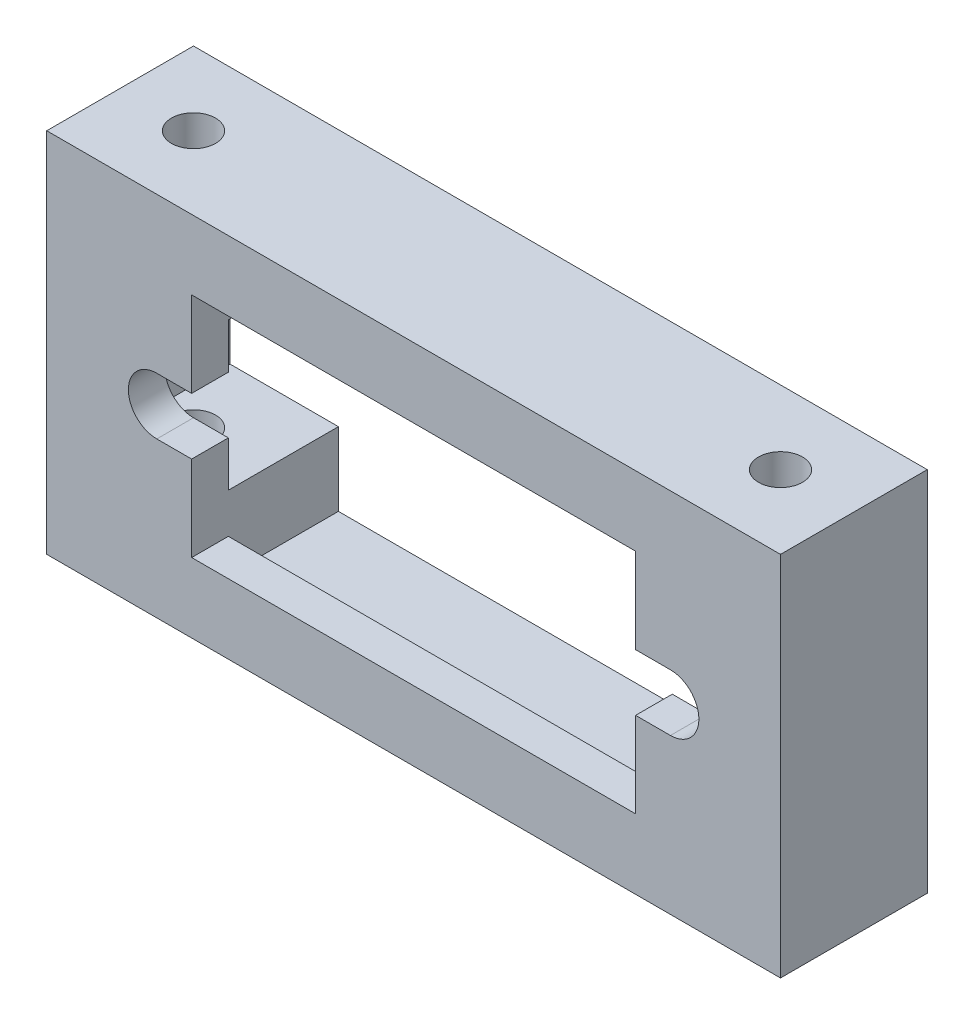
ISO-10303-21;
HEADER;
FILE_DESCRIPTION(('STEP AP214'),'2;1');
FILE_NAME('part.step','',(''),(''),'','','');
FILE_SCHEMA(('AUTOMOTIVE_DESIGN { 1 0 10303 214 1 1 1 1 }'));
ENDSEC;
DATA;
#1=APPLICATION_CONTEXT('core data for automotive mechanical design processes');
#2=APPLICATION_PROTOCOL_DEFINITION('international standard','automotive_design',2000,#1);
#3=PRODUCT_CONTEXT('',#1,'mechanical');
#4=PRODUCT('Part','Part','',(#3));
#5=PRODUCT_RELATED_PRODUCT_CATEGORY('part','',(#4));
#6=PRODUCT_DEFINITION_FORMATION('','',#4);
#7=PRODUCT_DEFINITION_CONTEXT('part definition',#1,'design');
#8=PRODUCT_DEFINITION('design','',#6,#7);
#9=PRODUCT_DEFINITION_SHAPE('','',#8);
#10=(LENGTH_UNIT() NAMED_UNIT(*) SI_UNIT(.MILLI.,.METRE.));
#11=(NAMED_UNIT(*) PLANE_ANGLE_UNIT() SI_UNIT($,.RADIAN.));
#12=(NAMED_UNIT(*) SI_UNIT($,.STERADIAN.) SOLID_ANGLE_UNIT());
#13=UNCERTAINTY_MEASURE_WITH_UNIT(LENGTH_MEASURE(1.E-05),#10,'distance_accuracy_value','');
#14=(GEOMETRIC_REPRESENTATION_CONTEXT(3) GLOBAL_UNCERTAINTY_ASSIGNED_CONTEXT((#13)) GLOBAL_UNIT_ASSIGNED_CONTEXT((#10,
#11,#12)) REPRESENTATION_CONTEXT('',''));
#15=CARTESIAN_POINT('',(0.,0.,0.));
#16=DIRECTION('',(0.,0.,1.));
#17=DIRECTION('',(1.,0.,0.));
#18=AXIS2_PLACEMENT_3D('',#15,#16,#17);
#19=CARTESIAN_POINT('',(0.,0.,0.));
#20=DIRECTION('',(0.,0.,1.));
#21=DIRECTION('',(1.,0.,0.));
#22=AXIS2_PLACEMENT_3D('',#19,#20,#21);
#23=PLANE('',#22);
#24=DIRECTION('',(1.,0.,0.));
#25=VECTOR('',#24,1.);
#26=CARTESIAN_POINT('',(18.,-4.02,0.));
#27=LINE('',#26,#25);
#28=CARTESIAN_POINT('',(12.1,-4.02,0.));
#29=VERTEX_POINT('',#28);
#30=CARTESIAN_POINT('',(18.,-4.02,0.));
#31=VERTEX_POINT('',#30);
#32=EDGE_CURVE('E553',#29,#31,#27,.T.);
#33=ORIENTED_EDGE('',*,*,#32,.F.);
#34=DIRECTION('',(0.,-1.,0.));
#35=VECTOR('',#34,1.);
#36=CARTESIAN_POINT('',(12.1,6.2,0.));
#37=LINE('',#36,#35);
#38=CARTESIAN_POINT('',(12.1,-1.55,0.));
#39=VERTEX_POINT('',#38);
#40=EDGE_CURVE('E413',#39,#29,#37,.T.);
#41=ORIENTED_EDGE('',*,*,#40,.F.);
#42=DIRECTION('',(1.,0.,0.));
#43=VECTOR('',#42,1.);
#44=CARTESIAN_POINT('',(0.,-1.55,0.));
#45=LINE('',#44,#43);
#46=CARTESIAN_POINT('',(14.,-1.55,0.));
#47=VERTEX_POINT('',#46);
#48=EDGE_CURVE('E334',#39,#47,#45,.T.);
#49=ORIENTED_EDGE('',*,*,#48,.T.);
#50=CARTESIAN_POINT('',(14.,0.,0.));
#51=DIRECTION('',(0.,0.,1.));
#52=DIRECTION('',(1.,0.,0.));
#53=AXIS2_PLACEMENT_3D('',#50,#51,#52);
#54=CIRCLE('',#53,1.55);
#55=CARTESIAN_POINT('',(14.,1.55,0.));
#56=VERTEX_POINT('',#55);
#57=EDGE_CURVE('E339',#56,#47,#54,.F.);
#58=ORIENTED_EDGE('',*,*,#57,.F.);
#59=DIRECTION('',(1.,0.,0.));
#60=VECTOR('',#59,1.);
#61=CARTESIAN_POINT('',(0.,1.55,0.));
#62=LINE('',#61,#60);
#63=CARTESIAN_POINT('',(12.1,1.55,0.));
#64=VERTEX_POINT('',#63);
#65=EDGE_CURVE('E331',#64,#56,#62,.T.);
#66=ORIENTED_EDGE('',*,*,#65,.F.);
#67=CARTESIAN_POINT('',(12.1,4.02,0.));
#68=VERTEX_POINT('',#67);
#69=EDGE_CURVE('E414',#68,#64,#37,.T.);
#70=ORIENTED_EDGE('',*,*,#69,.F.);
#71=DIRECTION('',(-1.,0.,0.));
#72=VECTOR('',#71,1.);
#73=CARTESIAN_POINT('',(18.,4.02000000000001,0.));
#74=LINE('',#73,#72);
#75=CARTESIAN_POINT('',(18.,4.02000000000001,0.));
#76=VERTEX_POINT('',#75);
#77=EDGE_CURVE('E516',#76,#68,#74,.T.);
#78=ORIENTED_EDGE('',*,*,#77,.F.);
#79=DIRECTION('',(0.,1.,0.));
#80=VECTOR('',#79,1.);
#81=CARTESIAN_POINT('',(18.,10.,0.));
#82=LINE('',#81,#80);
#83=EDGE_CURVE('E324',#31,#76,#82,.T.);
#84=ORIENTED_EDGE('',*,*,#83,.F.);
#85=EDGE_LOOP('',(#33,#41,#49,#58,#66,#70,#78,#84));
#86=FACE_BOUND('',#85,.T.);
#87=ADVANCED_FACE('F69',(#86),#23,.F.);
#88=DIRECTION('',(0.,1.,0.));
#89=VECTOR('',#88,1.);
#90=CARTESIAN_POINT('',(12.1,-8.02,0.));
#91=LINE('',#90,#89);
#92=CARTESIAN_POINT('',(12.1,-8.02,0.));
#93=VERTEX_POINT('',#92);
#94=CARTESIAN_POINT('',(12.1,-6.2,0.));
#95=VERTEX_POINT('',#94);
#96=EDGE_CURVE('E536',#93,#95,#91,.T.);
#97=ORIENTED_EDGE('',*,*,#96,.F.);
#98=DIRECTION('',(1.,0.,0.));
#99=VECTOR('',#98,1.);
#100=CARTESIAN_POINT('',(18.,-8.02,0.));
#101=LINE('',#100,#99);
#102=CARTESIAN_POINT('',(-12.1,-8.02,0.));
#103=VERTEX_POINT('',#102);
#104=EDGE_CURVE('E292',#103,#93,#101,.T.);
#105=ORIENTED_EDGE('',*,*,#104,.F.);
#106=DIRECTION('',(0.,-1.,0.));
#107=VECTOR('',#106,1.);
#108=CARTESIAN_POINT('',(-12.1,-8.02,0.));
#109=LINE('',#108,#107);
#110=CARTESIAN_POINT('',(-12.1,-6.2,0.));
#111=VERTEX_POINT('',#110);
#112=EDGE_CURVE('E527',#111,#103,#109,.T.);
#113=ORIENTED_EDGE('',*,*,#112,.F.);
#114=DIRECTION('',(1.,0.,0.));
#115=VECTOR('',#114,1.);
#116=CARTESIAN_POINT('',(-12.1,-6.2,0.));
#117=LINE('',#116,#115);
#118=EDGE_CURVE('E408',#111,#95,#117,.T.);
#119=ORIENTED_EDGE('',*,*,#118,.T.);
#120=EDGE_LOOP('',(#97,#105,#113,#119));
#121=FACE_BOUND('',#120,.T.);
#122=ADVANCED_FACE('F621',(#121),#23,.F.);
#123=DIRECTION('',(1.,0.,0.));
#124=VECTOR('',#123,1.);
#125=CARTESIAN_POINT('',(-18.,-4.02,0.));
#126=LINE('',#125,#124);
#127=CARTESIAN_POINT('',(-18.,-4.02,0.));
#128=VERTEX_POINT('',#127);
#129=CARTESIAN_POINT('',(-12.1,-4.02,0.));
#130=VERTEX_POINT('',#129);
#131=EDGE_CURVE('E270',#128,#130,#126,.T.);
#132=ORIENTED_EDGE('',*,*,#131,.F.);
#133=DIRECTION('',(0.,-1.,0.));
#134=VECTOR('',#133,1.);
#135=CARTESIAN_POINT('',(-18.,10.,0.));
#136=LINE('',#135,#134);
#137=CARTESIAN_POINT('',(-18.,4.02000000000001,0.));
#138=VERTEX_POINT('',#137);
#139=EDGE_CURVE('E309',#138,#128,#136,.T.);
#140=ORIENTED_EDGE('',*,*,#139,.F.);
#141=DIRECTION('',(-1.,0.,0.));
#142=VECTOR('',#141,1.);
#143=CARTESIAN_POINT('',(-18.,4.02000000000001,0.));
#144=LINE('',#143,#142);
#145=CARTESIAN_POINT('',(-12.1,4.02000000000001,0.));
#146=VERTEX_POINT('',#145);
#147=EDGE_CURVE('E511',#146,#138,#144,.T.);
#148=ORIENTED_EDGE('',*,*,#147,.F.);
#149=DIRECTION('',(0.,-1.,0.));
#150=VECTOR('',#149,1.);
#151=CARTESIAN_POINT('',(-12.1,6.2,0.));
#152=LINE('',#151,#150);
#153=CARTESIAN_POINT('',(-12.1,1.55,0.));
#154=VERTEX_POINT('',#153);
#155=EDGE_CURVE('E405',#146,#154,#152,.T.);
#156=ORIENTED_EDGE('',*,*,#155,.T.);
#157=DIRECTION('',(1.,0.,0.));
#158=VECTOR('',#157,1.);
#159=CARTESIAN_POINT('',(0.,1.55,0.));
#160=LINE('',#159,#158);
#161=CARTESIAN_POINT('',(-14.,1.55,0.));
#162=VERTEX_POINT('',#161);
#163=EDGE_CURVE('E369',#162,#154,#160,.T.);
#164=ORIENTED_EDGE('',*,*,#163,.F.);
#165=CARTESIAN_POINT('',(-14.,0.,0.));
#166=DIRECTION('',(0.,0.,1.));
#167=DIRECTION('',(1.,0.,0.));
#168=AXIS2_PLACEMENT_3D('',#165,#166,#167);
#169=CIRCLE('',#168,1.55);
#170=CARTESIAN_POINT('',(-14.,-1.55,0.));
#171=VERTEX_POINT('',#170);
#172=EDGE_CURVE('E373',#162,#171,#169,.T.);
#173=ORIENTED_EDGE('',*,*,#172,.T.);
#174=DIRECTION('',(1.,0.,0.));
#175=VECTOR('',#174,1.);
#176=CARTESIAN_POINT('',(0.,-1.55,0.));
#177=LINE('',#176,#175);
#178=CARTESIAN_POINT('',(-12.1,-1.55,0.));
#179=VERTEX_POINT('',#178);
#180=EDGE_CURVE('E378',#171,#179,#177,.T.);
#181=ORIENTED_EDGE('',*,*,#180,.T.);
#182=EDGE_CURVE('E409',#179,#130,#152,.T.);
#183=ORIENTED_EDGE('',*,*,#182,.T.);
#184=EDGE_LOOP('',(#132,#140,#148,#156,#164,#173,#181,#183));
#185=FACE_BOUND('',#184,.T.);
#186=ADVANCED_FACE('F634',(#185),#23,.F.);
#187=DIRECTION('',(0.,-1.,0.));
#188=VECTOR('',#187,1.);
#189=CARTESIAN_POINT('',(-12.1,8.02,0.));
#190=LINE('',#189,#188);
#191=CARTESIAN_POINT('',(-12.1,8.02,0.));
#192=VERTEX_POINT('',#191);
#193=CARTESIAN_POINT('',(-12.1,6.2,0.));
#194=VERTEX_POINT('',#193);
#195=EDGE_CURVE('E514',#192,#194,#190,.T.);
#196=ORIENTED_EDGE('',*,*,#195,.F.);
#197=DIRECTION('',(-1.,0.,0.));
#198=VECTOR('',#197,1.);
#199=CARTESIAN_POINT('',(18.,8.02,0.));
#200=LINE('',#199,#198);
#201=CARTESIAN_POINT('',(12.1,8.02,0.));
#202=VERTEX_POINT('',#201);
#203=EDGE_CURVE('E278',#202,#192,#200,.T.);
#204=ORIENTED_EDGE('',*,*,#203,.F.);
#205=DIRECTION('',(0.,1.,0.));
#206=VECTOR('',#205,1.);
#207=CARTESIAN_POINT('',(12.1,8.02,0.));
#208=LINE('',#207,#206);
#209=CARTESIAN_POINT('',(12.1,6.2,0.));
#210=VERTEX_POINT('',#209);
#211=EDGE_CURVE('E568',#210,#202,#208,.T.);
#212=ORIENTED_EDGE('',*,*,#211,.F.);
#213=DIRECTION('',(1.,0.,0.));
#214=VECTOR('',#213,1.);
#215=CARTESIAN_POINT('',(-12.1,6.2,0.));
#216=LINE('',#215,#214);
#217=EDGE_CURVE('E417',#194,#210,#216,.T.);
#218=ORIENTED_EDGE('',*,*,#217,.F.);
#219=EDGE_LOOP('',(#196,#204,#212,#218));
#220=FACE_BOUND('',#219,.T.);
#221=ADVANCED_FACE('F679',(#220),#23,.F.);
#222=CARTESIAN_POINT('',(18.,10.,-6.));
#223=DIRECTION('',(1.,0.,0.));
#224=DIRECTION('',(0.,1.,0.));
#225=AXIS2_PLACEMENT_3D('',#222,#223,#224);
#226=PLANE('',#225);
#227=DIRECTION('',(0.,0.,1.));
#228=VECTOR('',#227,1.);
#229=CARTESIAN_POINT('',(18.,-4.02,-13.1281133548787));
#230=LINE('',#229,#228);
#231=CARTESIAN_POINT('',(18.,-4.02,-6.));
#232=VERTEX_POINT('',#231);
#233=EDGE_CURVE('E549',#232,#31,#230,.T.);
#234=ORIENTED_EDGE('',*,*,#233,.T.);
#235=ORIENTED_EDGE('',*,*,#83,.T.);
#236=DIRECTION('',(0.,0.,1.));
#237=VECTOR('',#236,1.);
#238=CARTESIAN_POINT('',(18.,4.02000000000001,-13.1281133548787));
#239=LINE('',#238,#237);
#240=CARTESIAN_POINT('',(18.,4.02000000000001,-6.));
#241=VERTEX_POINT('',#240);
#242=EDGE_CURVE('E562',#241,#76,#239,.T.);
#243=ORIENTED_EDGE('',*,*,#242,.F.);
#244=DIRECTION('',(0.,1.,0.));
#245=VECTOR('',#244,1.);
#246=CARTESIAN_POINT('',(18.,10.,-6.));
#247=LINE('',#246,#245);
#248=EDGE_CURVE('E285',#232,#241,#247,.T.);
#249=ORIENTED_EDGE('',*,*,#248,.F.);
#250=EDGE_LOOP('',(#234,#235,#243,#249));
#251=FACE_BOUND('',#250,.T.);
#252=ADVANCED_FACE('F588',(#251),#226,.F.);
#253=CARTESIAN_POINT('',(-18.,10.,-6.));
#254=DIRECTION('',(-1.,0.,0.));
#255=DIRECTION('',(0.,-1.,0.));
#256=AXIS2_PLACEMENT_3D('',#253,#254,#255);
#257=PLANE('',#256);
#258=DIRECTION('',(0.,0.,1.));
#259=VECTOR('',#258,1.);
#260=CARTESIAN_POINT('',(-18.,-4.02,-13.1281133548787));
#261=LINE('',#260,#259);
#262=CARTESIAN_POINT('',(-18.,-4.02,-6.));
#263=VERTEX_POINT('',#262);
#264=EDGE_CURVE('E518',#263,#128,#261,.T.);
#265=ORIENTED_EDGE('',*,*,#264,.F.);
#266=DIRECTION('',(0.,-1.,0.));
#267=VECTOR('',#266,1.);
#268=CARTESIAN_POINT('',(-18.,10.,-6.));
#269=LINE('',#268,#267);
#270=CARTESIAN_POINT('',(-18.,4.02000000000001,-6.));
#271=VERTEX_POINT('',#270);
#272=EDGE_CURVE('E312',#271,#263,#269,.T.);
#273=ORIENTED_EDGE('',*,*,#272,.F.);
#274=DIRECTION('',(0.,0.,1.));
#275=VECTOR('',#274,1.);
#276=CARTESIAN_POINT('',(-18.,4.02000000000001,-13.1281133548787));
#277=LINE('',#276,#275);
#278=EDGE_CURVE('E507',#271,#138,#277,.T.);
#279=ORIENTED_EDGE('',*,*,#278,.T.);
#280=ORIENTED_EDGE('',*,*,#139,.T.);
#281=EDGE_LOOP('',(#265,#273,#279,#280));
#282=FACE_BOUND('',#281,.T.);
#283=ADVANCED_FACE('F692',(#282),#257,.F.);
#284=CARTESIAN_POINT('',(18.,-8.02,-42.0544088843515));
#285=DIRECTION('',(0.,-1.,0.));
#286=DIRECTION('',(1.,0.,0.));
#287=AXIS2_PLACEMENT_3D('',#284,#285,#286);
#288=PLANE('',#287);
#289=DIRECTION('',(0.,0.,1.));
#290=VECTOR('',#289,1.);
#291=CARTESIAN_POINT('',(12.1,-8.02,-13.1281133548787));
#292=LINE('',#291,#290);
#293=CARTESIAN_POINT('',(12.1,-8.02,-6.));
#294=VERTEX_POINT('',#293);
#295=EDGE_CURVE('E543',#294,#93,#292,.T.);
#296=ORIENTED_EDGE('',*,*,#295,.F.);
#297=DIRECTION('',(1.,0.,0.));
#298=VECTOR('',#297,1.);
#299=CARTESIAN_POINT('',(18.,-8.02,-6.));
#300=LINE('',#299,#298);
#301=CARTESIAN_POINT('',(-12.1,-8.02,-6.));
#302=VERTEX_POINT('',#301);
#303=EDGE_CURVE('E296',#302,#294,#300,.T.);
#304=ORIENTED_EDGE('',*,*,#303,.F.);
#305=DIRECTION('',(0.,0.,1.));
#306=VECTOR('',#305,1.);
#307=CARTESIAN_POINT('',(-12.1,-8.02,-13.1281133548787));
#308=LINE('',#307,#306);
#309=EDGE_CURVE('E87',#302,#103,#308,.T.);
#310=ORIENTED_EDGE('',*,*,#309,.T.);
#311=ORIENTED_EDGE('',*,*,#104,.T.);
#312=EDGE_LOOP('',(#296,#304,#310,#311));
#313=FACE_BOUND('',#312,.T.);
#314=ADVANCED_FACE('F626',(#313),#288,.F.);
#315=CARTESIAN_POINT('',(18.,8.02,-42.0544088843515));
#316=DIRECTION('',(0.,1.,0.));
#317=DIRECTION('',(0.,0.,1.));
#318=AXIS2_PLACEMENT_3D('',#315,#316,#317);
#319=PLANE('',#318);
#320=DIRECTION('',(0.,0.,1.));
#321=VECTOR('',#320,1.);
#322=CARTESIAN_POINT('',(-12.1,8.02,-13.1281133548787));
#323=LINE('',#322,#321);
#324=CARTESIAN_POINT('',(-12.1,8.02,-6.));
#325=VERTEX_POINT('',#324);
#326=EDGE_CURVE('E262',#325,#192,#323,.T.);
#327=ORIENTED_EDGE('',*,*,#326,.F.);
#328=DIRECTION('',(-1.,0.,0.));
#329=VECTOR('',#328,1.);
#330=CARTESIAN_POINT('',(18.,8.02,-6.));
#331=LINE('',#330,#329);
#332=CARTESIAN_POINT('',(12.1,8.02,-6.));
#333=VERTEX_POINT('',#332);
#334=EDGE_CURVE('E276',#333,#325,#331,.T.);
#335=ORIENTED_EDGE('',*,*,#334,.F.);
#336=DIRECTION('',(0.,0.,1.));
#337=VECTOR('',#336,1.);
#338=CARTESIAN_POINT('',(12.1,8.02,-13.1281133548787));
#339=LINE('',#338,#337);
#340=EDGE_CURVE('E95',#333,#202,#339,.T.);
#341=ORIENTED_EDGE('',*,*,#340,.T.);
#342=ORIENTED_EDGE('',*,*,#203,.T.);
#343=EDGE_LOOP('',(#327,#335,#341,#342));
#344=FACE_BOUND('',#343,.T.);
#345=ADVANCED_FACE('F275',(#344),#319,.F.);
#346=CARTESIAN_POINT('',(20.,10.,2.));
#347=DIRECTION('',(-1.,0.,0.));
#348=DIRECTION('',(0.,0.,1.));
#349=AXIS2_PLACEMENT_3D('',#346,#347,#348);
#350=PLANE('',#349);
#351=DIRECTION('',(0.,0.,-1.));
#352=VECTOR('',#351,1.);
#353=CARTESIAN_POINT('',(20.,-10.,2.));
#354=LINE('',#353,#352);
#355=CARTESIAN_POINT('',(20.,-10.,2.));
#356=VERTEX_POINT('',#355);
#357=CARTESIAN_POINT('',(20.,-10.,-6.));
#358=VERTEX_POINT('',#357);
#359=EDGE_CURVE('E462',#356,#358,#354,.T.);
#360=ORIENTED_EDGE('',*,*,#359,.T.);
#361=DIRECTION('',(0.,-1.,0.));
#362=VECTOR('',#361,1.);
#363=CARTESIAN_POINT('',(20.,10.,-6.));
#364=LINE('',#363,#362);
#365=CARTESIAN_POINT('',(20.,10.,-6.));
#366=VERTEX_POINT('',#365);
#367=EDGE_CURVE('E290',#366,#358,#364,.T.);
#368=ORIENTED_EDGE('',*,*,#367,.F.);
#369=DIRECTION('',(0.,0.,-1.));
#370=VECTOR('',#369,1.);
#371=CARTESIAN_POINT('',(20.,10.,2.));
#372=LINE('',#371,#370);
#373=CARTESIAN_POINT('',(20.,10.,2.));
#374=VERTEX_POINT('',#373);
#375=EDGE_CURVE('E12',#374,#366,#372,.T.);
#376=ORIENTED_EDGE('',*,*,#375,.F.);
#377=DIRECTION('',(0.,1.,0.));
#378=VECTOR('',#377,1.);
#379=CARTESIAN_POINT('',(20.,10.,2.));
#380=LINE('',#379,#378);
#381=EDGE_CURVE('E359',#356,#374,#380,.T.);
#382=ORIENTED_EDGE('',*,*,#381,.F.);
#383=EDGE_LOOP('',(#360,#368,#376,#382));
#384=FACE_BOUND('',#383,.T.);
#385=ADVANCED_FACE('F71',(#384),#350,.F.);
#386=CARTESIAN_POINT('',(-20.,10.,2.));
#387=DIRECTION('',(0.,-1.,0.));
#388=DIRECTION('',(0.,0.,-1.));
#389=AXIS2_PLACEMENT_3D('',#386,#387,#388);
#390=PLANE('',#389);
#391=CARTESIAN_POINT('',(-16.,10.,-2.));
#392=DIRECTION('',(0.,1.,0.));
#393=DIRECTION('',(0.,0.,1.));
#394=AXIS2_PLACEMENT_3D('',#391,#392,#393);
#395=CIRCLE('',#394,1.2);
#396=CARTESIAN_POINT('',(-16.,10.,-0.799999999999995));
#397=VERTEX_POINT('',#396);
#398=EDGE_CURVE('E482',#397,#397,#395,.T.);
#399=ORIENTED_EDGE('',*,*,#398,.F.);
#400=EDGE_LOOP('',(#399));
#401=FACE_BOUND('',#400,.T.);
#402=CARTESIAN_POINT('',(16.,10.,-2.));
#403=DIRECTION('',(0.,1.,0.));
#404=DIRECTION('',(0.,0.,1.));
#405=AXIS2_PLACEMENT_3D('',#402,#403,#404);
#406=CIRCLE('',#405,1.2);
#407=CARTESIAN_POINT('',(16.,10.,-0.799999999999995));
#408=VERTEX_POINT('',#407);
#409=EDGE_CURVE('E488',#408,#408,#406,.T.);
#410=ORIENTED_EDGE('',*,*,#409,.F.);
#411=EDGE_LOOP('',(#410));
#412=FACE_BOUND('',#411,.T.);
#413=ORIENTED_EDGE('',*,*,#375,.T.);
#414=DIRECTION('',(1.,0.,0.));
#415=VECTOR('',#414,1.);
#416=CARTESIAN_POINT('',(-20.,10.,-6.));
#417=LINE('',#416,#415);
#418=CARTESIAN_POINT('',(-20.,10.,-6.));
#419=VERTEX_POINT('',#418);
#420=EDGE_CURVE('E308',#419,#366,#417,.T.);
#421=ORIENTED_EDGE('',*,*,#420,.F.);
#422=DIRECTION('',(0.,0.,-1.));
#423=VECTOR('',#422,1.);
#424=CARTESIAN_POINT('',(-20.,10.,2.));
#425=LINE('',#424,#423);
#426=CARTESIAN_POINT('',(-20.,10.,2.));
#427=VERTEX_POINT('',#426);
#428=EDGE_CURVE('E79',#427,#419,#425,.T.);
#429=ORIENTED_EDGE('',*,*,#428,.F.);
#430=DIRECTION('',(-1.,0.,0.));
#431=VECTOR('',#430,1.);
#432=CARTESIAN_POINT('',(-20.,10.,2.));
#433=LINE('',#432,#431);
#434=EDGE_CURVE('E453',#374,#427,#433,.T.);
#435=ORIENTED_EDGE('',*,*,#434,.F.);
#436=EDGE_LOOP('',(#413,#421,#429,#435));
#437=FACE_BOUND('',#436,.T.);
#438=ADVANCED_FACE('F959',(#401,#412,#437),#390,.F.);
#439=CARTESIAN_POINT('',(-20.,10.,2.));
#440=DIRECTION('',(1.,0.,0.));
#441=DIRECTION('',(0.,0.,-1.));
#442=AXIS2_PLACEMENT_3D('',#439,#440,#441);
#443=PLANE('',#442);
#444=ORIENTED_EDGE('',*,*,#428,.T.);
#445=DIRECTION('',(0.,1.,0.));
#446=VECTOR('',#445,1.);
#447=CARTESIAN_POINT('',(-20.,10.,-6.));
#448=LINE('',#447,#446);
#449=CARTESIAN_POINT('',(-20.,-10.,-6.));
#450=VERTEX_POINT('',#449);
#451=EDGE_CURVE('E304',#450,#419,#448,.T.);
#452=ORIENTED_EDGE('',*,*,#451,.F.);
#453=DIRECTION('',(0.,0.,-1.));
#454=VECTOR('',#453,1.);
#455=CARTESIAN_POINT('',(-20.,-10.,2.));
#456=LINE('',#455,#454);
#457=CARTESIAN_POINT('',(-20.,-10.,2.));
#458=VERTEX_POINT('',#457);
#459=EDGE_CURVE('E466',#458,#450,#456,.T.);
#460=ORIENTED_EDGE('',*,*,#459,.F.);
#461=DIRECTION('',(0.,-1.,0.));
#462=VECTOR('',#461,1.);
#463=CARTESIAN_POINT('',(-20.,10.,2.));
#464=LINE('',#463,#462);
#465=EDGE_CURVE('E456',#427,#458,#464,.T.);
#466=ORIENTED_EDGE('',*,*,#465,.F.);
#467=EDGE_LOOP('',(#444,#452,#460,#466));
#468=FACE_BOUND('',#467,.T.);
#469=ADVANCED_FACE('F952',(#468),#443,.F.);
#470=CARTESIAN_POINT('',(-20.,-10.,2.));
#471=DIRECTION('',(0.,1.,0.));
#472=DIRECTION('',(0.,0.,1.));
#473=AXIS2_PLACEMENT_3D('',#470,#471,#472);
#474=PLANE('',#473);
#475=CARTESIAN_POINT('',(-16.,-10.,-2.));
#476=DIRECTION('',(0.,1.,0.));
#477=DIRECTION('',(0.,0.,1.));
#478=AXIS2_PLACEMENT_3D('',#475,#476,#477);
#479=CIRCLE('',#478,1.2);
#480=CARTESIAN_POINT('',(-16.,-10.,-0.799999999999995));
#481=VERTEX_POINT('',#480);
#482=EDGE_CURVE('E474',#481,#481,#479,.T.);
#483=ORIENTED_EDGE('',*,*,#482,.T.);
#484=EDGE_LOOP('',(#483));
#485=FACE_BOUND('',#484,.T.);
#486=CARTESIAN_POINT('',(16.,-10.,-2.));
#487=DIRECTION('',(0.,1.,0.));
#488=DIRECTION('',(0.,0.,1.));
#489=AXIS2_PLACEMENT_3D('',#486,#487,#488);
#490=CIRCLE('',#489,1.2);
#491=CARTESIAN_POINT('',(16.,-10.,-0.799999999999995));
#492=VERTEX_POINT('',#491);
#493=EDGE_CURVE('E494',#492,#492,#490,.T.);
#494=ORIENTED_EDGE('',*,*,#493,.T.);
#495=EDGE_LOOP('',(#494));
#496=FACE_BOUND('',#495,.T.);
#497=ORIENTED_EDGE('',*,*,#459,.T.);
#498=DIRECTION('',(-1.,0.,0.));
#499=VECTOR('',#498,1.);
#500=CARTESIAN_POINT('',(-20.,-10.,-6.));
#501=LINE('',#500,#499);
#502=EDGE_CURVE('E316',#358,#450,#501,.T.);
#503=ORIENTED_EDGE('',*,*,#502,.F.);
#504=ORIENTED_EDGE('',*,*,#359,.F.);
#505=DIRECTION('',(1.,0.,0.));
#506=VECTOR('',#505,1.);
#507=CARTESIAN_POINT('',(-20.,-10.,2.));
#508=LINE('',#507,#506);
#509=EDGE_CURVE('E459',#458,#356,#508,.T.);
#510=ORIENTED_EDGE('',*,*,#509,.F.);
#511=EDGE_LOOP('',(#497,#503,#504,#510));
#512=FACE_BOUND('',#511,.T.);
#513=ADVANCED_FACE('F946',(#485,#496,#512),#474,.F.);
#514=CARTESIAN_POINT('',(0.,0.,2.));
#515=DIRECTION('',(0.,0.,1.));
#516=DIRECTION('',(1.,0.,0.));
#517=AXIS2_PLACEMENT_3D('',#514,#515,#516);
#518=PLANE('',#517);
#519=DIRECTION('',(1.,0.,0.));
#520=VECTOR('',#519,1.);
#521=CARTESIAN_POINT('',(-12.1,-6.2,2.));
#522=LINE('',#521,#520);
#523=CARTESIAN_POINT('',(-12.1,-6.2,2.));
#524=VERTEX_POINT('',#523);
#525=CARTESIAN_POINT('',(12.1,-6.2,2.));
#526=VERTEX_POINT('',#525);
#527=EDGE_CURVE('E426',#524,#526,#522,.T.);
#528=ORIENTED_EDGE('',*,*,#527,.F.);
#529=DIRECTION('',(0.,-1.,0.));
#530=VECTOR('',#529,1.);
#531=CARTESIAN_POINT('',(-12.1,6.2,2.));
#532=LINE('',#531,#530);
#533=CARTESIAN_POINT('',(-12.1,-1.55,2.));
#534=VERTEX_POINT('',#533);
#535=EDGE_CURVE('E320',#534,#524,#532,.T.);
#536=ORIENTED_EDGE('',*,*,#535,.F.);
#537=DIRECTION('',(1.,0.,0.));
#538=VECTOR('',#537,1.);
#539=CARTESIAN_POINT('',(0.,-1.55,2.));
#540=LINE('',#539,#538);
#541=CARTESIAN_POINT('',(-14.,-1.55,2.));
#542=VERTEX_POINT('',#541);
#543=EDGE_CURVE('E374',#542,#534,#540,.T.);
#544=ORIENTED_EDGE('',*,*,#543,.F.);
#545=CARTESIAN_POINT('',(-14.,0.,2.));
#546=DIRECTION('',(0.,0.,1.));
#547=DIRECTION('',(1.,0.,0.));
#548=AXIS2_PLACEMENT_3D('',#545,#546,#547);
#549=CIRCLE('',#548,1.55);
#550=CARTESIAN_POINT('',(-14.,1.55,2.));
#551=VERTEX_POINT('',#550);
#552=EDGE_CURVE('E387',#551,#542,#549,.T.);
#553=ORIENTED_EDGE('',*,*,#552,.F.);
#554=DIRECTION('',(1.,0.,0.));
#555=VECTOR('',#554,1.);
#556=CARTESIAN_POINT('',(0.,1.55,2.));
#557=LINE('',#556,#555);
#558=CARTESIAN_POINT('',(-12.1,1.55,2.));
#559=VERTEX_POINT('',#558);
#560=EDGE_CURVE('E383',#551,#559,#557,.T.);
#561=ORIENTED_EDGE('',*,*,#560,.T.);
#562=CARTESIAN_POINT('',(-12.1,6.2,2.));
#563=VERTEX_POINT('',#562);
#564=EDGE_CURVE('E422',#563,#559,#532,.T.);
#565=ORIENTED_EDGE('',*,*,#564,.F.);
#566=DIRECTION('',(1.,0.,0.));
#567=VECTOR('',#566,1.);
#568=CARTESIAN_POINT('',(-12.1,6.2,2.));
#569=LINE('',#568,#567);
#570=CARTESIAN_POINT('',(12.1,6.2,2.));
#571=VERTEX_POINT('',#570);
#572=EDGE_CURVE('E435',#563,#571,#569,.T.);
#573=ORIENTED_EDGE('',*,*,#572,.T.);
#574=DIRECTION('',(0.,-1.,0.));
#575=VECTOR('',#574,1.);
#576=CARTESIAN_POINT('',(12.1,6.2,2.));
#577=LINE('',#576,#575);
#578=CARTESIAN_POINT('',(12.1,1.55,2.));
#579=VERTEX_POINT('',#578);
#580=EDGE_CURVE('E431',#571,#579,#577,.T.);
#581=ORIENTED_EDGE('',*,*,#580,.T.);
#582=DIRECTION('',(1.,0.,0.));
#583=VECTOR('',#582,1.);
#584=CARTESIAN_POINT('',(0.,1.55,2.));
#585=LINE('',#584,#583);
#586=CARTESIAN_POINT('',(14.,1.55,2.));
#587=VERTEX_POINT('',#586);
#588=EDGE_CURVE('E343',#579,#587,#585,.T.);
#589=ORIENTED_EDGE('',*,*,#588,.T.);
#590=CARTESIAN_POINT('',(14.,0.,2.));
#591=DIRECTION('',(0.,0.,1.));
#592=DIRECTION('',(1.,0.,0.));
#593=AXIS2_PLACEMENT_3D('',#590,#591,#592);
#594=CIRCLE('',#593,1.55);
#595=CARTESIAN_POINT('',(14.,-1.55,2.));
#596=VERTEX_POINT('',#595);
#597=EDGE_CURVE('E335',#587,#596,#594,.F.);
#598=ORIENTED_EDGE('',*,*,#597,.T.);
#599=DIRECTION('',(1.,0.,0.));
#600=VECTOR('',#599,1.);
#601=CARTESIAN_POINT('',(0.,-1.55,2.));
#602=LINE('',#601,#600);
#603=CARTESIAN_POINT('',(12.1,-1.55,2.));
#604=VERTEX_POINT('',#603);
#605=EDGE_CURVE('E347',#604,#596,#602,.T.);
#606=ORIENTED_EDGE('',*,*,#605,.F.);
#607=EDGE_CURVE('E430',#604,#526,#577,.T.);
#608=ORIENTED_EDGE('',*,*,#607,.T.);
#609=EDGE_LOOP('',(#528,#536,#544,#553,#561,#565,#573,#581,#589,#598,#606,#608));
#610=FACE_BOUND('',#609,.T.);
#611=ORIENTED_EDGE('',*,*,#381,.T.);
#612=ORIENTED_EDGE('',*,*,#434,.T.);
#613=ORIENTED_EDGE('',*,*,#465,.T.);
#614=ORIENTED_EDGE('',*,*,#509,.T.);
#615=EDGE_LOOP('',(#611,#612,#613,#614));
#616=FACE_BOUND('',#615,.T.);
#617=ADVANCED_FACE('F616',(#610,#616),#518,.T.);
#618=CARTESIAN_POINT('',(0.,1.55,0.));
#619=DIRECTION('',(0.,-1.,0.));
#620=DIRECTION('',(0.,0.,-1.));
#621=AXIS2_PLACEMENT_3D('',#618,#619,#620);
#622=PLANE('',#621);
#623=ORIENTED_EDGE('',*,*,#588,.F.);
#624=DIRECTION('',(0.,0.,1.));
#625=VECTOR('',#624,1.);
#626=CARTESIAN_POINT('',(12.1,1.55,0.));
#627=LINE('',#626,#625);
#628=EDGE_CURVE('E342',#64,#579,#627,.T.);
#629=ORIENTED_EDGE('',*,*,#628,.F.);
#630=ORIENTED_EDGE('',*,*,#65,.T.);
#631=DIRECTION('',(0.,0.,1.));
#632=VECTOR('',#631,1.);
#633=CARTESIAN_POINT('',(14.,1.55,0.));
#634=LINE('',#633,#632);
#635=EDGE_CURVE('E355',#56,#587,#634,.T.);
#636=ORIENTED_EDGE('',*,*,#635,.T.);
#637=EDGE_LOOP('',(#623,#629,#630,#636));
#638=FACE_BOUND('',#637,.T.);
#639=ADVANCED_FACE('F658',(#638),#622,.T.);
#640=CARTESIAN_POINT('',(14.,0.,0.));
#641=DIRECTION('',(0.,0.,1.));
#642=DIRECTION('',(1.,0.,0.));
#643=AXIS2_PLACEMENT_3D('',#640,#641,#642);
#644=CYLINDRICAL_SURFACE('',#643,1.55);
#645=ORIENTED_EDGE('',*,*,#597,.F.);
#646=ORIENTED_EDGE('',*,*,#635,.F.);
#647=ORIENTED_EDGE('',*,*,#57,.T.);
#648=DIRECTION('',(0.,0.,1.));
#649=VECTOR('',#648,1.);
#650=CARTESIAN_POINT('',(14.,-1.55,0.));
#651=LINE('',#650,#649);
#652=EDGE_CURVE('E360',#47,#596,#651,.T.);
#653=ORIENTED_EDGE('',*,*,#652,.T.);
#654=EDGE_LOOP('',(#645,#646,#647,#653));
#655=FACE_BOUND('',#654,.T.);
#656=ADVANCED_FACE('F663',(#655),#644,.F.);
#657=CARTESIAN_POINT('',(0.,-1.55,0.));
#658=DIRECTION('',(0.,-1.,0.));
#659=DIRECTION('',(0.,0.,-1.));
#660=AXIS2_PLACEMENT_3D('',#657,#658,#659);
#661=PLANE('',#660);
#662=ORIENTED_EDGE('',*,*,#605,.T.);
#663=ORIENTED_EDGE('',*,*,#652,.F.);
#664=ORIENTED_EDGE('',*,*,#48,.F.);
#665=DIRECTION('',(0.,0.,1.));
#666=VECTOR('',#665,1.);
#667=CARTESIAN_POINT('',(12.1,-1.55,0.));
#668=LINE('',#667,#666);
#669=EDGE_CURVE('E363',#39,#604,#668,.T.);
#670=ORIENTED_EDGE('',*,*,#669,.T.);
#671=EDGE_LOOP('',(#662,#663,#664,#670));
#672=FACE_BOUND('',#671,.T.);
#673=ADVANCED_FACE('F665',(#672),#661,.F.);
#674=CARTESIAN_POINT('',(-14.,0.,0.));
#675=DIRECTION('',(0.,0.,1.));
#676=DIRECTION('',(1.,0.,0.));
#677=AXIS2_PLACEMENT_3D('',#674,#675,#676);
#678=CYLINDRICAL_SURFACE('',#677,1.55);
#679=ORIENTED_EDGE('',*,*,#552,.T.);
#680=DIRECTION('',(0.,0.,1.));
#681=VECTOR('',#680,1.);
#682=CARTESIAN_POINT('',(-14.,-1.55,0.));
#683=LINE('',#682,#681);
#684=EDGE_CURVE('E400',#171,#542,#683,.T.);
#685=ORIENTED_EDGE('',*,*,#684,.F.);
#686=ORIENTED_EDGE('',*,*,#172,.F.);
#687=DIRECTION('',(0.,0.,1.));
#688=VECTOR('',#687,1.);
#689=CARTESIAN_POINT('',(-14.,1.55,0.));
#690=LINE('',#689,#688);
#691=EDGE_CURVE('E382',#162,#551,#690,.T.);
#692=ORIENTED_EDGE('',*,*,#691,.T.);
#693=EDGE_LOOP('',(#679,#685,#686,#692));
#694=FACE_BOUND('',#693,.T.);
#695=ADVANCED_FACE('F644',(#694),#678,.F.);
#696=CARTESIAN_POINT('',(0.,-1.55,0.));
#697=DIRECTION('',(0.,-1.,0.));
#698=DIRECTION('',(0.,0.,-1.));
#699=AXIS2_PLACEMENT_3D('',#696,#697,#698);
#700=PLANE('',#699);
#701=ORIENTED_EDGE('',*,*,#543,.T.);
#702=DIRECTION('',(0.,0.,1.));
#703=VECTOR('',#702,1.);
#704=CARTESIAN_POINT('',(-12.1,-1.55,0.));
#705=LINE('',#704,#703);
#706=EDGE_CURVE('E397',#179,#534,#705,.T.);
#707=ORIENTED_EDGE('',*,*,#706,.F.);
#708=ORIENTED_EDGE('',*,*,#180,.F.);
#709=ORIENTED_EDGE('',*,*,#684,.T.);
#710=EDGE_LOOP('',(#701,#707,#708,#709));
#711=FACE_BOUND('',#710,.T.);
#712=ADVANCED_FACE('F639',(#711),#700,.F.);
#713=CARTESIAN_POINT('',(0.,1.55,0.));
#714=DIRECTION('',(0.,-1.,0.));
#715=DIRECTION('',(0.,0.,-1.));
#716=AXIS2_PLACEMENT_3D('',#713,#714,#715);
#717=PLANE('',#716);
#718=ORIENTED_EDGE('',*,*,#560,.F.);
#719=ORIENTED_EDGE('',*,*,#691,.F.);
#720=ORIENTED_EDGE('',*,*,#163,.T.);
#721=DIRECTION('',(0.,0.,1.));
#722=VECTOR('',#721,1.);
#723=CARTESIAN_POINT('',(-12.1,1.55,0.));
#724=LINE('',#723,#722);
#725=EDGE_CURVE('E348',#154,#559,#724,.T.);
#726=ORIENTED_EDGE('',*,*,#725,.T.);
#727=EDGE_LOOP('',(#718,#719,#720,#726));
#728=FACE_BOUND('',#727,.T.);
#729=ADVANCED_FACE('F646',(#728),#717,.T.);
#730=CARTESIAN_POINT('',(-12.1,6.2,0.));
#731=DIRECTION('',(-1.,0.,0.));
#732=DIRECTION('',(0.,0.,1.));
#733=AXIS2_PLACEMENT_3D('',#730,#731,#732);
#734=PLANE('',#733);
#735=ORIENTED_EDGE('',*,*,#706,.T.);
#736=ORIENTED_EDGE('',*,*,#535,.T.);
#737=DIRECTION('',(0.,0.,1.));
#738=VECTOR('',#737,1.);
#739=CARTESIAN_POINT('',(-12.1,-6.2,0.));
#740=LINE('',#739,#738);
#741=EDGE_CURVE('E421',#111,#524,#740,.T.);
#742=ORIENTED_EDGE('',*,*,#741,.F.);
#743=ORIENTED_EDGE('',*,*,#112,.T.);
#744=ORIENTED_EDGE('',*,*,#309,.F.);
#745=DIRECTION('',(0.,1.,0.));
#746=VECTOR('',#745,1.);
#747=CARTESIAN_POINT('',(-12.1,-8.02,-6.));
#748=LINE('',#747,#746);
#749=CARTESIAN_POINT('',(-12.1,-4.02,-6.));
#750=VERTEX_POINT('',#749);
#751=EDGE_CURVE('E522',#302,#750,#748,.T.);
#752=ORIENTED_EDGE('',*,*,#751,.T.);
#753=DIRECTION('',(0.,0.,1.));
#754=VECTOR('',#753,1.);
#755=CARTESIAN_POINT('',(-12.1,-4.02,-13.1281133548787));
#756=LINE('',#755,#754);
#757=EDGE_CURVE('E521',#750,#130,#756,.T.);
#758=ORIENTED_EDGE('',*,*,#757,.T.);
#759=ORIENTED_EDGE('',*,*,#182,.F.);
#760=EDGE_LOOP('',(#735,#736,#742,#743,#744,#752,#758,#759));
#761=FACE_BOUND('',#760,.T.);
#762=ADVANCED_FACE('F607',(#761),#734,.F.);
#763=ORIENTED_EDGE('',*,*,#155,.F.);
#764=DIRECTION('',(0.,0.,1.));
#765=VECTOR('',#764,1.);
#766=CARTESIAN_POINT('',(-12.1,4.02000000000001,-13.1281133548787));
#767=LINE('',#766,#765);
#768=CARTESIAN_POINT('',(-12.1,4.02000000000001,-6.));
#769=VERTEX_POINT('',#768);
#770=EDGE_CURVE('E264',#769,#146,#767,.T.);
#771=ORIENTED_EDGE('',*,*,#770,.F.);
#772=DIRECTION('',(0.,1.,0.));
#773=VECTOR('',#772,1.);
#774=CARTESIAN_POINT('',(-12.1,8.02,-6.));
#775=LINE('',#774,#773);
#776=EDGE_CURVE('E258',#769,#325,#775,.T.);
#777=ORIENTED_EDGE('',*,*,#776,.T.);
#778=ORIENTED_EDGE('',*,*,#326,.T.);
#779=ORIENTED_EDGE('',*,*,#195,.T.);
#780=DIRECTION('',(0.,0.,1.));
#781=VECTOR('',#780,1.);
#782=CARTESIAN_POINT('',(-12.1,6.2,0.));
#783=LINE('',#782,#781);
#784=EDGE_CURVE('E388',#194,#563,#783,.T.);
#785=ORIENTED_EDGE('',*,*,#784,.T.);
#786=ORIENTED_EDGE('',*,*,#564,.T.);
#787=ORIENTED_EDGE('',*,*,#725,.F.);
#788=EDGE_LOOP('',(#763,#771,#777,#778,#779,#785,#786,#787));
#789=FACE_BOUND('',#788,.T.);
#790=ADVANCED_FACE('F261',(#789),#734,.F.);
#791=CARTESIAN_POINT('',(-12.1,6.2,0.));
#792=DIRECTION('',(0.,-1.,0.));
#793=DIRECTION('',(0.,0.,-1.));
#794=AXIS2_PLACEMENT_3D('',#791,#792,#793);
#795=PLANE('',#794);
#796=ORIENTED_EDGE('',*,*,#572,.F.);
#797=ORIENTED_EDGE('',*,*,#784,.F.);
#798=ORIENTED_EDGE('',*,*,#217,.T.);
#799=DIRECTION('',(0.,0.,1.));
#800=VECTOR('',#799,1.);
#801=CARTESIAN_POINT('',(12.1,6.2,0.));
#802=LINE('',#801,#800);
#803=EDGE_CURVE('E441',#210,#571,#802,.T.);
#804=ORIENTED_EDGE('',*,*,#803,.T.);
#805=EDGE_LOOP('',(#796,#797,#798,#804));
#806=FACE_BOUND('',#805,.T.);
#807=ADVANCED_FACE('F652',(#806),#795,.T.);
#808=CARTESIAN_POINT('',(-12.1,-6.2,0.));
#809=DIRECTION('',(0.,-1.,0.));
#810=DIRECTION('',(0.,0.,-1.));
#811=AXIS2_PLACEMENT_3D('',#808,#809,#810);
#812=PLANE('',#811);
#813=ORIENTED_EDGE('',*,*,#527,.T.);
#814=DIRECTION('',(0.,0.,1.));
#815=VECTOR('',#814,1.);
#816=CARTESIAN_POINT('',(12.1,-6.2,0.));
#817=LINE('',#816,#815);
#818=EDGE_CURVE('E444',#95,#526,#817,.T.);
#819=ORIENTED_EDGE('',*,*,#818,.F.);
#820=ORIENTED_EDGE('',*,*,#118,.F.);
#821=ORIENTED_EDGE('',*,*,#741,.T.);
#822=EDGE_LOOP('',(#813,#819,#820,#821));
#823=FACE_BOUND('',#822,.T.);
#824=ADVANCED_FACE('F614',(#823),#812,.F.);
#825=CARTESIAN_POINT('',(12.1,6.2,0.));
#826=DIRECTION('',(-1.,0.,0.));
#827=DIRECTION('',(0.,0.,1.));
#828=AXIS2_PLACEMENT_3D('',#825,#826,#827);
#829=PLANE('',#828);
#830=ORIENTED_EDGE('',*,*,#40,.T.);
#831=DIRECTION('',(0.,0.,1.));
#832=VECTOR('',#831,1.);
#833=CARTESIAN_POINT('',(12.1,-4.02,-13.1281133548787));
#834=LINE('',#833,#832);
#835=CARTESIAN_POINT('',(12.1,-4.02,-6.));
#836=VERTEX_POINT('',#835);
#837=EDGE_CURVE('E546',#836,#29,#834,.T.);
#838=ORIENTED_EDGE('',*,*,#837,.F.);
#839=DIRECTION('',(0.,-1.,0.));
#840=VECTOR('',#839,1.);
#841=CARTESIAN_POINT('',(12.1,-8.02,-6.));
#842=LINE('',#841,#840);
#843=EDGE_CURVE('E502',#836,#294,#842,.T.);
#844=ORIENTED_EDGE('',*,*,#843,.T.);
#845=ORIENTED_EDGE('',*,*,#295,.T.);
#846=ORIENTED_EDGE('',*,*,#96,.T.);
#847=ORIENTED_EDGE('',*,*,#818,.T.);
#848=ORIENTED_EDGE('',*,*,#607,.F.);
#849=ORIENTED_EDGE('',*,*,#669,.F.);
#850=EDGE_LOOP('',(#830,#838,#844,#845,#846,#847,#848,#849));
#851=FACE_BOUND('',#850,.T.);
#852=ADVANCED_FACE('F596',(#851),#829,.T.);
#853=ORIENTED_EDGE('',*,*,#628,.T.);
#854=ORIENTED_EDGE('',*,*,#580,.F.);
#855=ORIENTED_EDGE('',*,*,#803,.F.);
#856=ORIENTED_EDGE('',*,*,#211,.T.);
#857=ORIENTED_EDGE('',*,*,#340,.F.);
#858=DIRECTION('',(0.,-1.,0.));
#859=VECTOR('',#858,1.);
#860=CARTESIAN_POINT('',(12.1,8.02,-6.));
#861=LINE('',#860,#859);
#862=CARTESIAN_POINT('',(12.1,4.02,-6.));
#863=VERTEX_POINT('',#862);
#864=EDGE_CURVE('E283',#333,#863,#861,.T.);
#865=ORIENTED_EDGE('',*,*,#864,.T.);
#866=DIRECTION('',(0.,0.,1.));
#867=VECTOR('',#866,1.);
#868=CARTESIAN_POINT('',(12.1,4.02,-13.1281133548787));
#869=LINE('',#868,#867);
#870=EDGE_CURVE('E573',#863,#68,#869,.T.);
#871=ORIENTED_EDGE('',*,*,#870,.T.);
#872=ORIENTED_EDGE('',*,*,#69,.T.);
#873=EDGE_LOOP('',(#853,#854,#855,#856,#857,#865,#871,#872));
#874=FACE_BOUND('',#873,.T.);
#875=ADVANCED_FACE('F655',(#874),#829,.T.);
#876=CARTESIAN_POINT('',(0.,0.,-6.));
#877=DIRECTION('',(0.,0.,1.));
#878=DIRECTION('',(1.,0.,0.));
#879=AXIS2_PLACEMENT_3D('',#876,#877,#878);
#880=PLANE('',#879);
#881=DIRECTION('',(-1.,0.,0.));
#882=VECTOR('',#881,1.);
#883=CARTESIAN_POINT('',(18.,-4.02,-6.));
#884=LINE('',#883,#882);
#885=EDGE_CURVE('E539',#232,#836,#884,.T.);
#886=ORIENTED_EDGE('',*,*,#885,.F.);
#887=ORIENTED_EDGE('',*,*,#248,.T.);
#888=DIRECTION('',(1.,0.,0.));
#889=VECTOR('',#888,1.);
#890=CARTESIAN_POINT('',(18.,4.02000000000001,-6.));
#891=LINE('',#890,#889);
#892=EDGE_CURVE('E300',#863,#241,#891,.T.);
#893=ORIENTED_EDGE('',*,*,#892,.F.);
#894=ORIENTED_EDGE('',*,*,#864,.F.);
#895=ORIENTED_EDGE('',*,*,#334,.T.);
#896=ORIENTED_EDGE('',*,*,#776,.F.);
#897=DIRECTION('',(1.,0.,0.));
#898=VECTOR('',#897,1.);
#899=CARTESIAN_POINT('',(-18.,4.02000000000001,-6.));
#900=LINE('',#899,#898);
#901=EDGE_CURVE('E269',#271,#769,#900,.T.);
#902=ORIENTED_EDGE('',*,*,#901,.F.);
#903=ORIENTED_EDGE('',*,*,#272,.T.);
#904=DIRECTION('',(-1.,0.,0.));
#905=VECTOR('',#904,1.);
#906=CARTESIAN_POINT('',(-18.,-4.02,-6.));
#907=LINE('',#906,#905);
#908=EDGE_CURVE('E533',#750,#263,#907,.T.);
#909=ORIENTED_EDGE('',*,*,#908,.F.);
#910=ORIENTED_EDGE('',*,*,#751,.F.);
#911=ORIENTED_EDGE('',*,*,#303,.T.);
#912=ORIENTED_EDGE('',*,*,#843,.F.);
#913=EDGE_LOOP('',(#886,#887,#893,#894,#895,#896,#902,#903,#909,#910,#911,#912));
#914=FACE_BOUND('',#913,.T.);
#915=ORIENTED_EDGE('',*,*,#451,.T.);
#916=ORIENTED_EDGE('',*,*,#420,.T.);
#917=ORIENTED_EDGE('',*,*,#367,.T.);
#918=ORIENTED_EDGE('',*,*,#502,.T.);
#919=EDGE_LOOP('',(#915,#916,#917,#918));
#920=FACE_BOUND('',#919,.T.);
#921=ADVANCED_FACE('F281',(#914,#920),#880,.F.);
#922=CARTESIAN_POINT('',(18.,4.02000000000001,-13.1281133548787));
#923=DIRECTION('',(0.,1.,0.));
#924=DIRECTION('',(-1.,0.,0.));
#925=AXIS2_PLACEMENT_3D('',#922,#923,#924);
#926=PLANE('',#925);
#927=CARTESIAN_POINT('',(16.,4.02000000000001,-2.));
#928=DIRECTION('',(0.,1.,0.));
#929=DIRECTION('',(-1.,0.,0.));
#930=AXIS2_PLACEMENT_3D('',#927,#928,#929);
#931=CIRCLE('',#930,1.2);
#932=CARTESIAN_POINT('',(14.8,4.02,-2.));
#933=VERTEX_POINT('',#932);
#934=EDGE_CURVE('E473',#933,#933,#931,.T.);
#935=ORIENTED_EDGE('',*,*,#934,.T.);
#936=EDGE_LOOP('',(#935));
#937=FACE_BOUND('',#936,.T.);
#938=ORIENTED_EDGE('',*,*,#870,.F.);
#939=ORIENTED_EDGE('',*,*,#892,.T.);
#940=ORIENTED_EDGE('',*,*,#242,.T.);
#941=ORIENTED_EDGE('',*,*,#77,.T.);
#942=EDGE_LOOP('',(#938,#939,#940,#941));
#943=FACE_BOUND('',#942,.T.);
#944=ADVANCED_FACE('F580',(#937,#943),#926,.F.);
#945=CARTESIAN_POINT('',(-18.,4.02000000000001,-13.1281133548787));
#946=DIRECTION('',(0.,1.,0.));
#947=DIRECTION('',(-1.,0.,0.));
#948=AXIS2_PLACEMENT_3D('',#945,#946,#947);
#949=PLANE('',#948);
#950=CARTESIAN_POINT('',(-16.,4.02000000000001,-2.));
#951=DIRECTION('',(0.,1.,0.));
#952=DIRECTION('',(-1.,0.,0.));
#953=AXIS2_PLACEMENT_3D('',#950,#951,#952);
#954=CIRCLE('',#953,1.2);
#955=CARTESIAN_POINT('',(-17.2,4.02000000000001,-2.));
#956=VERTEX_POINT('',#955);
#957=EDGE_CURVE('E498',#956,#956,#954,.T.);
#958=ORIENTED_EDGE('',*,*,#957,.T.);
#959=EDGE_LOOP('',(#958));
#960=FACE_BOUND('',#959,.T.);
#961=ORIENTED_EDGE('',*,*,#278,.F.);
#962=ORIENTED_EDGE('',*,*,#901,.T.);
#963=ORIENTED_EDGE('',*,*,#770,.T.);
#964=ORIENTED_EDGE('',*,*,#147,.T.);
#965=EDGE_LOOP('',(#961,#962,#963,#964));
#966=FACE_BOUND('',#965,.T.);
#967=ADVANCED_FACE('F781',(#960,#966),#949,.F.);
#968=CARTESIAN_POINT('',(-18.,-4.02,-13.1281133548787));
#969=DIRECTION('',(0.,-1.,0.));
#970=DIRECTION('',(0.,0.,-1.));
#971=AXIS2_PLACEMENT_3D('',#968,#969,#970);
#972=PLANE('',#971);
#973=CARTESIAN_POINT('',(-16.,-4.02,-2.));
#974=DIRECTION('',(0.,-1.,0.));
#975=DIRECTION('',(0.,0.,-1.));
#976=AXIS2_PLACEMENT_3D('',#973,#974,#975);
#977=CIRCLE('',#976,1.2);
#978=CARTESIAN_POINT('',(-16.,-4.02,-3.2));
#979=VERTEX_POINT('',#978);
#980=EDGE_CURVE('E73',#979,#979,#977,.T.);
#981=ORIENTED_EDGE('',*,*,#980,.T.);
#982=EDGE_LOOP('',(#981));
#983=FACE_BOUND('',#982,.T.);
#984=ORIENTED_EDGE('',*,*,#757,.F.);
#985=ORIENTED_EDGE('',*,*,#908,.T.);
#986=ORIENTED_EDGE('',*,*,#264,.T.);
#987=ORIENTED_EDGE('',*,*,#131,.T.);
#988=EDGE_LOOP('',(#984,#985,#986,#987));
#989=FACE_BOUND('',#988,.T.);
#990=ADVANCED_FACE('F630',(#983,#989),#972,.F.);
#991=CARTESIAN_POINT('',(18.,-4.02,-13.1281133548787));
#992=DIRECTION('',(0.,-1.,0.));
#993=DIRECTION('',(1.,0.,0.));
#994=AXIS2_PLACEMENT_3D('',#991,#992,#993);
#995=PLANE('',#994);
#996=CARTESIAN_POINT('',(16.,-4.02,-2.));
#997=DIRECTION('',(0.,-1.,0.));
#998=DIRECTION('',(1.,0.,0.));
#999=AXIS2_PLACEMENT_3D('',#996,#997,#998);
#1000=CIRCLE('',#999,1.2);
#1001=CARTESIAN_POINT('',(17.2,-4.02,-2.));
#1002=VERTEX_POINT('',#1001);
#1003=EDGE_CURVE('E470',#1002,#1002,#1000,.T.);
#1004=ORIENTED_EDGE('',*,*,#1003,.T.);
#1005=EDGE_LOOP('',(#1004));
#1006=FACE_BOUND('',#1005,.T.);
#1007=ORIENTED_EDGE('',*,*,#233,.F.);
#1008=ORIENTED_EDGE('',*,*,#885,.T.);
#1009=ORIENTED_EDGE('',*,*,#837,.T.);
#1010=ORIENTED_EDGE('',*,*,#32,.T.);
#1011=EDGE_LOOP('',(#1007,#1008,#1009,#1010));
#1012=FACE_BOUND('',#1011,.T.);
#1013=ADVANCED_FACE('F591',(#1006,#1012),#995,.F.);
#1014=CARTESIAN_POINT('',(16.,-10.,-2.));
#1015=DIRECTION('',(0.,1.,0.));
#1016=DIRECTION('',(0.,0.,1.));
#1017=AXIS2_PLACEMENT_3D('',#1014,#1015,#1016);
#1018=CYLINDRICAL_SURFACE('',#1017,1.2);
#1019=ORIENTED_EDGE('',*,*,#493,.F.);
#1020=EDGE_LOOP('',(#1019));
#1021=FACE_BOUND('',#1020,.T.);
#1022=ORIENTED_EDGE('',*,*,#1003,.F.);
#1023=EDGE_LOOP('',(#1022));
#1024=FACE_BOUND('',#1023,.T.);
#1025=ADVANCED_FACE('F810',(#1021,#1024),#1018,.F.);
#1026=CARTESIAN_POINT('',(-16.,-10.,-2.));
#1027=DIRECTION('',(0.,1.,0.));
#1028=DIRECTION('',(0.,0.,1.));
#1029=AXIS2_PLACEMENT_3D('',#1026,#1027,#1028);
#1030=CYLINDRICAL_SURFACE('',#1029,1.2);
#1031=ORIENTED_EDGE('',*,*,#482,.F.);
#1032=EDGE_LOOP('',(#1031));
#1033=FACE_BOUND('',#1032,.T.);
#1034=ORIENTED_EDGE('',*,*,#980,.F.);
#1035=EDGE_LOOP('',(#1034));
#1036=FACE_BOUND('',#1035,.T.);
#1037=ADVANCED_FACE('F819',(#1033,#1036),#1030,.F.);
#1038=ORIENTED_EDGE('',*,*,#398,.T.);
#1039=EDGE_LOOP('',(#1038));
#1040=FACE_BOUND('',#1039,.T.);
#1041=ORIENTED_EDGE('',*,*,#957,.F.);
#1042=EDGE_LOOP('',(#1041));
#1043=FACE_BOUND('',#1042,.T.);
#1044=ADVANCED_FACE('F830',(#1040,#1043),#1030,.F.);
#1045=ORIENTED_EDGE('',*,*,#409,.T.);
#1046=EDGE_LOOP('',(#1045));
#1047=FACE_BOUND('',#1046,.T.);
#1048=ORIENTED_EDGE('',*,*,#934,.F.);
#1049=EDGE_LOOP('',(#1048));
#1050=FACE_BOUND('',#1049,.T.);
#1051=ADVANCED_FACE('F822',(#1047,#1050),#1018,.F.);
#1052=CLOSED_SHELL('',(#87,#122,#186,#221,#252,#283,#314,#345,#385,#438,#469,#513,#617,#639,
#656,#673,#695,#712,#729,#762,#790,#807,#824,#852,#875,#921,#944,#967,#990,#1013,#1025,#1037,
#1044,#1051));
#1053=MANIFOLD_SOLID_BREP('B2',#1052);
#1054=ADVANCED_BREP_SHAPE_REPRESENTATION('',(#18,#1053),#14);
#1055=SHAPE_DEFINITION_REPRESENTATION(#9,#1054);
ENDSEC;
END-ISO-10303-21;
